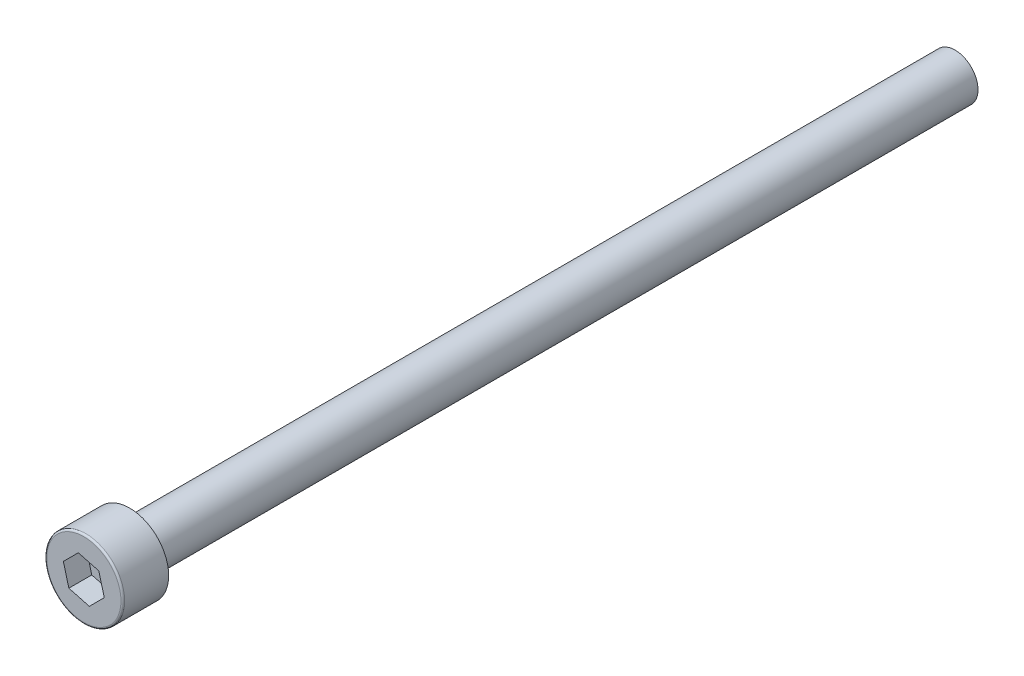
ISO-10303-21;
HEADER;
FILE_DESCRIPTION(('STEP AP214'),'2;1');
FILE_NAME('part.step','',(''),(''),'','','');
FILE_SCHEMA(('AUTOMOTIVE_DESIGN { 1 0 10303 214 1 1 1 1 }'));
ENDSEC;
DATA;
#1=APPLICATION_CONTEXT('core data for automotive mechanical design processes');
#2=APPLICATION_PROTOCOL_DEFINITION('international standard','automotive_design',2000,#1);
#3=PRODUCT_CONTEXT('',#1,'mechanical');
#4=PRODUCT('Part','Part','',(#3));
#5=PRODUCT_RELATED_PRODUCT_CATEGORY('part','',(#4));
#6=PRODUCT_DEFINITION_FORMATION('','',#4);
#7=PRODUCT_DEFINITION_CONTEXT('part definition',#1,'design');
#8=PRODUCT_DEFINITION('design','',#6,#7);
#9=PRODUCT_DEFINITION_SHAPE('','',#8);
#10=(LENGTH_UNIT() NAMED_UNIT(*) SI_UNIT(.MILLI.,.METRE.));
#11=(NAMED_UNIT(*) PLANE_ANGLE_UNIT() SI_UNIT($,.RADIAN.));
#12=(NAMED_UNIT(*) SI_UNIT($,.STERADIAN.) SOLID_ANGLE_UNIT());
#13=UNCERTAINTY_MEASURE_WITH_UNIT(LENGTH_MEASURE(1.E-05),#10,'distance_accuracy_value','');
#14=(GEOMETRIC_REPRESENTATION_CONTEXT(3) GLOBAL_UNCERTAINTY_ASSIGNED_CONTEXT((#13)) GLOBAL_UNIT_ASSIGNED_CONTEXT((#10,
#11,#12)) REPRESENTATION_CONTEXT('',''));
#15=CARTESIAN_POINT('',(0.,0.,0.));
#16=DIRECTION('',(0.,0.,1.));
#17=DIRECTION('',(1.,0.,0.));
#18=AXIS2_PLACEMENT_3D('',#15,#16,#17);
#19=CARTESIAN_POINT('',(0.,0.,0.));
#20=DIRECTION('',(0.,0.,1.));
#21=DIRECTION('',(1.,0.,0.));
#22=AXIS2_PLACEMENT_3D('',#19,#20,#21);
#23=PLANE('',#22);
#24=CARTESIAN_POINT('',(0.,0.,0.));
#25=DIRECTION('',(0.,0.,1.));
#26=DIRECTION('',(1.,0.,0.));
#27=AXIS2_PLACEMENT_3D('',#24,#25,#26);
#28=CIRCLE('',#27,4.25);
#29=CARTESIAN_POINT('',(4.25,0.,0.));
#30=VERTEX_POINT('',#29);
#31=EDGE_CURVE('E138',#30,#30,#28,.T.);
#32=ORIENTED_EDGE('',*,*,#31,.F.);
#33=EDGE_LOOP('',(#32));
#34=FACE_BOUND('',#33,.T.);
#35=CARTESIAN_POINT('',(0.,0.,0.));
#36=DIRECTION('',(0.,0.,1.));
#37=DIRECTION('',(1.,0.,0.));
#38=AXIS2_PLACEMENT_3D('',#35,#36,#37);
#39=CIRCLE('',#38,2.5);
#40=CARTESIAN_POINT('',(2.5,0.,0.));
#41=VERTEX_POINT('',#40);
#42=EDGE_CURVE('E146',#41,#41,#39,.F.);
#43=ORIENTED_EDGE('',*,*,#42,.F.);
#44=EDGE_LOOP('',(#43));
#45=FACE_BOUND('',#44,.T.);
#46=ADVANCED_FACE('F35',(#34,#45),#23,.F.);
#47=CARTESIAN_POINT('',(0.,0.,5.));
#48=DIRECTION('',(0.,0.,-1.));
#49=DIRECTION('',(-1.,0.,0.));
#50=AXIS2_PLACEMENT_3D('',#47,#48,#49);
#51=CYLINDRICAL_SURFACE('',#50,4.25);
#52=CARTESIAN_POINT('',(0.,0.,4.8));
#53=DIRECTION('',(0.,0.,1.));
#54=DIRECTION('',(1.,0.,0.));
#55=AXIS2_PLACEMENT_3D('',#52,#53,#54);
#56=CIRCLE('',#55,4.25);
#57=CARTESIAN_POINT('',(4.25,0.,4.8));
#58=VERTEX_POINT('',#57);
#59=EDGE_CURVE('E11',#58,#58,#56,.F.);
#60=ORIENTED_EDGE('',*,*,#59,.T.);
#61=EDGE_LOOP('',(#60));
#62=FACE_BOUND('',#61,.T.);
#63=ORIENTED_EDGE('',*,*,#31,.T.);
#64=EDGE_LOOP('',(#63));
#65=FACE_BOUND('',#64,.T.);
#66=ADVANCED_FACE('F165',(#62,#65),#51,.T.);
#67=CARTESIAN_POINT('',(0.,0.,5.));
#68=DIRECTION('',(0.,0.,1.));
#69=DIRECTION('',(1.,0.,0.));
#70=AXIS2_PLACEMENT_3D('',#67,#68,#69);
#71=PLANE('',#70);
#72=CARTESIAN_POINT('',(0.,0.,5.));
#73=DIRECTION('',(0.,0.,1.));
#74=DIRECTION('',(1.,0.,0.));
#75=AXIS2_PLACEMENT_3D('',#72,#73,#74);
#76=CIRCLE('',#75,4.05);
#77=CARTESIAN_POINT('',(4.05,0.,5.));
#78=VERTEX_POINT('',#77);
#79=EDGE_CURVE('E43',#78,#78,#76,.T.);
#80=ORIENTED_EDGE('',*,*,#79,.T.);
#81=EDGE_LOOP('',(#80));
#82=FACE_BOUND('',#81,.T.);
#83=DIRECTION('',(0.258819045102521,-0.965925826289068,0.));
#84=VECTOR('',#83,1.);
#85=CARTESIAN_POINT('',(-2.23071014330082,0.597716981445369,5.));
#86=LINE('',#85,#84);
#87=CARTESIAN_POINT('',(-2.23071014330082,0.597716981445369,5.));
#88=VERTEX_POINT('',#87);
#89=CARTESIAN_POINT('',(-1.63299316185545,-1.63299316185545,5.));
#90=VERTEX_POINT('',#89);
#91=EDGE_CURVE('E50',#88,#90,#86,.T.);
#92=ORIENTED_EDGE('',*,*,#91,.F.);
#93=DIRECTION('',(-0.707106781186547,-0.707106781186548,0.));
#94=VECTOR('',#93,1.);
#95=CARTESIAN_POINT('',(-0.597716981445369,2.23071014330082,5.));
#96=LINE('',#95,#94);
#97=CARTESIAN_POINT('',(-0.597716981445369,2.23071014330082,5.));
#98=VERTEX_POINT('',#97);
#99=EDGE_CURVE('E134',#98,#88,#96,.T.);
#100=ORIENTED_EDGE('',*,*,#99,.F.);
#101=DIRECTION('',(-0.965925826289068,0.258819045102521,0.));
#102=VECTOR('',#101,1.);
#103=CARTESIAN_POINT('',(1.63299316185545,1.63299316185545,5.));
#104=LINE('',#103,#102);
#105=CARTESIAN_POINT('',(1.63299316185545,1.63299316185545,5.));
#106=VERTEX_POINT('',#105);
#107=EDGE_CURVE('E132',#106,#98,#104,.T.);
#108=ORIENTED_EDGE('',*,*,#107,.F.);
#109=DIRECTION('',(-0.258819045102521,0.965925826289068,0.));
#110=VECTOR('',#109,1.);
#111=CARTESIAN_POINT('',(2.23071014330082,-0.597716981445369,5.));
#112=LINE('',#111,#110);
#113=CARTESIAN_POINT('',(2.23071014330082,-0.597716981445369,5.));
#114=VERTEX_POINT('',#113);
#115=EDGE_CURVE('E98',#114,#106,#112,.T.);
#116=ORIENTED_EDGE('',*,*,#115,.F.);
#117=DIRECTION('',(0.707106781186547,0.707106781186547,0.));
#118=VECTOR('',#117,1.);
#119=CARTESIAN_POINT('',(0.597716981445369,-2.23071014330082,5.));
#120=LINE('',#119,#118);
#121=CARTESIAN_POINT('',(0.597716981445369,-2.23071014330082,5.));
#122=VERTEX_POINT('',#121);
#123=EDGE_CURVE('E128',#122,#114,#120,.T.);
#124=ORIENTED_EDGE('',*,*,#123,.F.);
#125=DIRECTION('',(0.965925826289068,-0.258819045102521,0.));
#126=VECTOR('',#125,1.);
#127=CARTESIAN_POINT('',(-1.63299316185545,-1.63299316185545,5.));
#128=LINE('',#127,#126);
#129=EDGE_CURVE('E124',#90,#122,#128,.T.);
#130=ORIENTED_EDGE('',*,*,#129,.F.);
#131=EDGE_LOOP('',(#92,#100,#108,#116,#124,#130));
#132=FACE_BOUND('',#131,.T.);
#133=ADVANCED_FACE('F151',(#82,#132),#71,.T.);
#134=CARTESIAN_POINT('',(-2.23071014330082,0.597716981445369,2.5));
#135=DIRECTION('',(-0.965925826289068,-0.258819045102521,0.));
#136=DIRECTION('',(0.258819045102521,-0.965925826289068,0.));
#137=AXIS2_PLACEMENT_3D('',#134,#135,#136);
#138=PLANE('',#137);
#139=ORIENTED_EDGE('',*,*,#91,.T.);
#140=DIRECTION('',(0.,0.,1.));
#141=VECTOR('',#140,1.);
#142=CARTESIAN_POINT('',(-1.63299316185545,-1.63299316185545,2.5));
#143=LINE('',#142,#141);
#144=CARTESIAN_POINT('',(-1.63299316185545,-1.63299316185545,2.5));
#145=VERTEX_POINT('',#144);
#146=EDGE_CURVE('E80',#145,#90,#143,.T.);
#147=ORIENTED_EDGE('',*,*,#146,.F.);
#148=DIRECTION('',(0.258819045102521,-0.965925826289068,0.));
#149=VECTOR('',#148,1.);
#150=CARTESIAN_POINT('',(-2.23071014330082,0.597716981445369,2.5));
#151=LINE('',#150,#149);
#152=CARTESIAN_POINT('',(-2.23071014330082,0.597716981445369,2.5));
#153=VERTEX_POINT('',#152);
#154=EDGE_CURVE('E136',#153,#145,#151,.T.);
#155=ORIENTED_EDGE('',*,*,#154,.F.);
#156=DIRECTION('',(0.,0.,1.));
#157=VECTOR('',#156,1.);
#158=CARTESIAN_POINT('',(-2.23071014330082,0.597716981445369,2.5));
#159=LINE('',#158,#157);
#160=EDGE_CURVE('E58',#153,#88,#159,.T.);
#161=ORIENTED_EDGE('',*,*,#160,.T.);
#162=EDGE_LOOP('',(#139,#147,#155,#161));
#163=FACE_BOUND('',#162,.T.);
#164=ADVANCED_FACE('F177',(#163),#138,.F.);
#165=CARTESIAN_POINT('',(-0.597716981445369,2.23071014330082,2.5));
#166=DIRECTION('',(-0.707106781186548,0.707106781186547,0.));
#167=DIRECTION('',(-0.707106781186547,-0.707106781186548,0.));
#168=AXIS2_PLACEMENT_3D('',#165,#166,#167);
#169=PLANE('',#168);
#170=ORIENTED_EDGE('',*,*,#99,.T.);
#171=ORIENTED_EDGE('',*,*,#160,.F.);
#172=DIRECTION('',(-0.707106781186547,-0.707106781186548,0.));
#173=VECTOR('',#172,1.);
#174=CARTESIAN_POINT('',(-0.597716981445369,2.23071014330082,2.5));
#175=LINE('',#174,#173);
#176=CARTESIAN_POINT('',(-0.597716981445369,2.23071014330082,2.5));
#177=VERTEX_POINT('',#176);
#178=EDGE_CURVE('E110',#177,#153,#175,.T.);
#179=ORIENTED_EDGE('',*,*,#178,.F.);
#180=DIRECTION('',(0.,0.,1.));
#181=VECTOR('',#180,1.);
#182=CARTESIAN_POINT('',(-0.597716981445369,2.23071014330082,2.5));
#183=LINE('',#182,#181);
#184=EDGE_CURVE('E102',#177,#98,#183,.T.);
#185=ORIENTED_EDGE('',*,*,#184,.T.);
#186=EDGE_LOOP('',(#170,#171,#179,#185));
#187=FACE_BOUND('',#186,.T.);
#188=ADVANCED_FACE('F180',(#187),#169,.F.);
#189=CARTESIAN_POINT('',(1.63299316185545,1.63299316185545,2.5));
#190=DIRECTION('',(0.258819045102521,0.965925826289068,0.));
#191=DIRECTION('',(-0.965925826289068,0.258819045102521,0.));
#192=AXIS2_PLACEMENT_3D('',#189,#190,#191);
#193=PLANE('',#192);
#194=ORIENTED_EDGE('',*,*,#107,.T.);
#195=ORIENTED_EDGE('',*,*,#184,.F.);
#196=DIRECTION('',(-0.965925826289068,0.258819045102521,0.));
#197=VECTOR('',#196,1.);
#198=CARTESIAN_POINT('',(1.63299316185545,1.63299316185545,2.5));
#199=LINE('',#198,#197);
#200=CARTESIAN_POINT('',(1.63299316185545,1.63299316185545,2.5));
#201=VERTEX_POINT('',#200);
#202=EDGE_CURVE('E106',#201,#177,#199,.T.);
#203=ORIENTED_EDGE('',*,*,#202,.F.);
#204=DIRECTION('',(0.,0.,1.));
#205=VECTOR('',#204,1.);
#206=CARTESIAN_POINT('',(1.63299316185545,1.63299316185545,2.5));
#207=LINE('',#206,#205);
#208=EDGE_CURVE('E91',#201,#106,#207,.T.);
#209=ORIENTED_EDGE('',*,*,#208,.T.);
#210=EDGE_LOOP('',(#194,#195,#203,#209));
#211=FACE_BOUND('',#210,.T.);
#212=ADVANCED_FACE('F107',(#211),#193,.F.);
#213=CARTESIAN_POINT('',(2.23071014330082,-0.597716981445369,2.5));
#214=DIRECTION('',(0.965925826289068,0.258819045102521,0.));
#215=DIRECTION('',(-0.258819045102521,0.965925826289068,0.));
#216=AXIS2_PLACEMENT_3D('',#213,#214,#215);
#217=PLANE('',#216);
#218=ORIENTED_EDGE('',*,*,#115,.T.);
#219=ORIENTED_EDGE('',*,*,#208,.F.);
#220=DIRECTION('',(-0.258819045102521,0.965925826289068,0.));
#221=VECTOR('',#220,1.);
#222=CARTESIAN_POINT('',(2.23071014330082,-0.597716981445369,2.5));
#223=LINE('',#222,#221);
#224=CARTESIAN_POINT('',(2.23071014330082,-0.597716981445369,2.5));
#225=VERTEX_POINT('',#224);
#226=EDGE_CURVE('E95',#225,#201,#223,.T.);
#227=ORIENTED_EDGE('',*,*,#226,.F.);
#228=DIRECTION('',(0.,0.,1.));
#229=VECTOR('',#228,1.);
#230=CARTESIAN_POINT('',(2.23071014330082,-0.597716981445369,2.5));
#231=LINE('',#230,#229);
#232=EDGE_CURVE('E103',#225,#114,#231,.T.);
#233=ORIENTED_EDGE('',*,*,#232,.T.);
#234=EDGE_LOOP('',(#218,#219,#227,#233));
#235=FACE_BOUND('',#234,.T.);
#236=ADVANCED_FACE('F93',(#235),#217,.F.);
#237=CARTESIAN_POINT('',(0.597716981445369,-2.23071014330082,2.5));
#238=DIRECTION('',(0.707106781186548,-0.707106781186548,0.));
#239=DIRECTION('',(0.707106781186548,0.707106781186548,0.));
#240=AXIS2_PLACEMENT_3D('',#237,#238,#239);
#241=PLANE('',#240);
#242=ORIENTED_EDGE('',*,*,#123,.T.);
#243=ORIENTED_EDGE('',*,*,#232,.F.);
#244=DIRECTION('',(0.707106781186547,0.707106781186547,0.));
#245=VECTOR('',#244,1.);
#246=CARTESIAN_POINT('',(0.597716981445369,-2.23071014330082,2.5));
#247=LINE('',#246,#245);
#248=CARTESIAN_POINT('',(0.597716981445369,-2.23071014330082,2.5));
#249=VERTEX_POINT('',#248);
#250=EDGE_CURVE('E116',#249,#225,#247,.T.);
#251=ORIENTED_EDGE('',*,*,#250,.F.);
#252=DIRECTION('',(0.,0.,1.));
#253=VECTOR('',#252,1.);
#254=CARTESIAN_POINT('',(0.597716981445369,-2.23071014330082,2.5));
#255=LINE('',#254,#253);
#256=EDGE_CURVE('E141',#249,#122,#255,.T.);
#257=ORIENTED_EDGE('',*,*,#256,.T.);
#258=EDGE_LOOP('',(#242,#243,#251,#257));
#259=FACE_BOUND('',#258,.T.);
#260=ADVANCED_FACE('F184',(#259),#241,.F.);
#261=CARTESIAN_POINT('',(-1.63299316185545,-1.63299316185545,2.5));
#262=DIRECTION('',(-0.258819045102521,-0.965925826289068,0.));
#263=DIRECTION('',(0.965925826289068,-0.258819045102521,0.));
#264=AXIS2_PLACEMENT_3D('',#261,#262,#263);
#265=PLANE('',#264);
#266=ORIENTED_EDGE('',*,*,#129,.T.);
#267=ORIENTED_EDGE('',*,*,#256,.F.);
#268=DIRECTION('',(0.965925826289068,-0.258819045102521,0.));
#269=VECTOR('',#268,1.);
#270=CARTESIAN_POINT('',(-1.63299316185545,-1.63299316185545,2.5));
#271=LINE('',#270,#269);
#272=EDGE_CURVE('E118',#145,#249,#271,.T.);
#273=ORIENTED_EDGE('',*,*,#272,.F.);
#274=ORIENTED_EDGE('',*,*,#146,.T.);
#275=EDGE_LOOP('',(#266,#267,#273,#274));
#276=FACE_BOUND('',#275,.T.);
#277=ADVANCED_FACE('F181',(#276),#265,.F.);
#278=CARTESIAN_POINT('',(0.,0.,2.5));
#279=DIRECTION('',(0.,0.,1.));
#280=DIRECTION('',(1.,0.,0.));
#281=AXIS2_PLACEMENT_3D('',#278,#279,#280);
#282=PLANE('',#281);
#283=ORIENTED_EDGE('',*,*,#154,.T.);
#284=ORIENTED_EDGE('',*,*,#272,.T.);
#285=ORIENTED_EDGE('',*,*,#250,.T.);
#286=ORIENTED_EDGE('',*,*,#226,.T.);
#287=ORIENTED_EDGE('',*,*,#202,.T.);
#288=ORIENTED_EDGE('',*,*,#178,.T.);
#289=EDGE_LOOP('',(#283,#284,#285,#286,#287,#288));
#290=FACE_BOUND('',#289,.T.);
#291=ADVANCED_FACE('F113',(#290),#282,.T.);
#292=CARTESIAN_POINT('',(0.,0.,-90.));
#293=DIRECTION('',(0.,0.,1.));
#294=DIRECTION('',(1.,0.,0.));
#295=AXIS2_PLACEMENT_3D('',#292,#293,#294);
#296=CYLINDRICAL_SURFACE('',#295,2.5);
#297=CARTESIAN_POINT('',(0.,0.,-90.));
#298=DIRECTION('',(0.,0.,-1.));
#299=DIRECTION('',(-1.,0.,0.));
#300=AXIS2_PLACEMENT_3D('',#297,#298,#299);
#301=CIRCLE('',#300,2.5);
#302=CARTESIAN_POINT('',(2.5,0.,-90.));
#303=VERTEX_POINT('',#302);
#304=EDGE_CURVE('E125',#303,#303,#301,.T.);
#305=CARTESIAN_POINT('',(2.5,0.,-90.));
#306=CARTESIAN_POINT('',(2.5,0.,-89.0625));
#307=CARTESIAN_POINT('',(2.5,0.,-88.125));
#308=CARTESIAN_POINT('',(2.5,0.,-86.25));
#309=CARTESIAN_POINT('',(2.5,0.,-85.3125));
#310=CARTESIAN_POINT('',(2.5,0.,-83.4375));
#311=CARTESIAN_POINT('',(2.5,0.,-82.5));
#312=CARTESIAN_POINT('',(2.5,0.,-80.625));
#313=CARTESIAN_POINT('',(2.5,0.,-79.6875));
#314=CARTESIAN_POINT('',(2.5,0.,-77.8125));
#315=CARTESIAN_POINT('',(2.5,0.,-76.875));
#316=CARTESIAN_POINT('',(2.5,0.,-75.));
#317=CARTESIAN_POINT('',(2.5,0.,-74.0625));
#318=CARTESIAN_POINT('',(2.5,0.,-72.1875));
#319=CARTESIAN_POINT('',(2.5,0.,-71.25));
#320=CARTESIAN_POINT('',(2.5,0.,-69.375));
#321=CARTESIAN_POINT('',(2.5,0.,-68.4375));
#322=CARTESIAN_POINT('',(2.5,0.,-66.5625));
#323=CARTESIAN_POINT('',(2.5,0.,-65.625));
#324=CARTESIAN_POINT('',(2.5,0.,-63.75));
#325=CARTESIAN_POINT('',(2.5,0.,-62.8125));
#326=CARTESIAN_POINT('',(2.5,0.,-60.9375));
#327=CARTESIAN_POINT('',(2.5,0.,-60.));
#328=CARTESIAN_POINT('',(2.5,0.,-58.125));
#329=CARTESIAN_POINT('',(2.5,0.,-57.1875));
#330=CARTESIAN_POINT('',(2.5,0.,-55.3125));
#331=CARTESIAN_POINT('',(2.5,0.,-54.375));
#332=CARTESIAN_POINT('',(2.5,0.,-52.5));
#333=CARTESIAN_POINT('',(2.5,0.,-51.5625));
#334=CARTESIAN_POINT('',(2.5,0.,-49.6875));
#335=CARTESIAN_POINT('',(2.5,0.,-48.75));
#336=CARTESIAN_POINT('',(2.5,0.,-46.875));
#337=CARTESIAN_POINT('',(2.5,0.,-45.9375));
#338=CARTESIAN_POINT('',(2.5,0.,-44.0625));
#339=CARTESIAN_POINT('',(2.5,0.,-43.125));
#340=CARTESIAN_POINT('',(2.5,0.,-41.25));
#341=CARTESIAN_POINT('',(2.5,0.,-40.3125));
#342=CARTESIAN_POINT('',(2.5,0.,-38.4375));
#343=CARTESIAN_POINT('',(2.5,0.,-37.5));
#344=CARTESIAN_POINT('',(2.5,0.,-35.625));
#345=CARTESIAN_POINT('',(2.5,0.,-34.6875));
#346=CARTESIAN_POINT('',(2.5,0.,-32.8125));
#347=CARTESIAN_POINT('',(2.5,0.,-31.875));
#348=CARTESIAN_POINT('',(2.5,0.,-30.));
#349=CARTESIAN_POINT('',(2.5,0.,-29.0625));
#350=CARTESIAN_POINT('',(2.5,0.,-27.1875));
#351=CARTESIAN_POINT('',(2.5,0.,-26.25));
#352=CARTESIAN_POINT('',(2.5,0.,-24.375));
#353=CARTESIAN_POINT('',(2.5,0.,-23.4375));
#354=CARTESIAN_POINT('',(2.5,0.,-21.5625));
#355=CARTESIAN_POINT('',(2.5,0.,-20.625));
#356=CARTESIAN_POINT('',(2.5,0.,-18.75));
#357=CARTESIAN_POINT('',(2.5,0.,-17.8125));
#358=CARTESIAN_POINT('',(2.5,0.,-15.9375));
#359=CARTESIAN_POINT('',(2.5,0.,-15.));
#360=CARTESIAN_POINT('',(2.5,0.,-13.125));
#361=CARTESIAN_POINT('',(2.5,0.,-12.1875));
#362=CARTESIAN_POINT('',(2.5,0.,-10.3125));
#363=CARTESIAN_POINT('',(2.5,0.,-9.37500000000001));
#364=CARTESIAN_POINT('',(2.5,0.,-7.50000000000002));
#365=CARTESIAN_POINT('',(2.5,0.,-6.56250000000002));
#366=CARTESIAN_POINT('',(2.5,0.,-4.68750000000002));
#367=CARTESIAN_POINT('',(2.5,0.,-3.75000000000001));
#368=CARTESIAN_POINT('',(2.5,0.,-1.87500000000001));
#369=CARTESIAN_POINT('',(2.5,0.,-0.937500000000014));
#370=CARTESIAN_POINT('',(2.5,0.,0.));
#371=B_SPLINE_CURVE_WITH_KNOTS('',3,(#305,#306,#307,#308,#309,#310,#311,#312,#313,#314,#315,
#316,#317,#318,#319,#320,#321,#322,#323,#324,#325,#326,#327,#328,#329,#330,#331,#332,#333,#334,
#335,#336,#337,#338,#339,#340,#341,#342,#343,#344,#345,#346,#347,#348,#349,#350,#351,#352,#353,
#354,#355,#356,#357,#358,#359,#360,#361,#362,#363,#364,#365,#366,#367,#368,#369,#370),
.UNSPECIFIED.,.F.,.F.,(4,2,2,2,2,2,2,2,2,2,2,2,2,2,2,2,2,2,2,2,2,2,2,2,2,2,2,2,2,2,2,2,4),(0.,
2.81250000000001,5.62500000000001,8.4375,11.25,14.0625,16.875,19.6875,22.5,25.3125,28.125,
30.9375,33.75,36.5625,39.375,42.1875,45.,47.8125,50.625,53.4375,56.25,59.0625,61.875,64.6875,
67.5,70.3125,73.125,75.9375,78.75,81.5625,84.375,87.1875,90.),.UNSPECIFIED.);
#372=EDGE_CURVE('BSEAM160',#303,#41,#371,.T.);
#373=ORIENTED_EDGE('',*,*,#304,.F.);
#374=ORIENTED_EDGE('',*,*,#42,.T.);
#375=ORIENTED_EDGE('',*,*,#372,.T.);
#376=ORIENTED_EDGE('',*,*,#372,.F.);
#377=EDGE_LOOP('',(#373,#375,#374,#376));
#378=FACE_BOUND('',#377,.T.);
#379=ADVANCED_FACE('F160',(#378),#296,.T.);
#380=CARTESIAN_POINT('',(0.,0.,-90.));
#381=DIRECTION('',(0.,0.,-1.));
#382=DIRECTION('',(-1.,0.,0.));
#383=AXIS2_PLACEMENT_3D('',#380,#381,#382);
#384=PLANE('',#383);
#385=ORIENTED_EDGE('',*,*,#304,.T.);
#386=EDGE_LOOP('',(#385));
#387=FACE_BOUND('',#386,.T.);
#388=ADVANCED_FACE('F155',(#387),#384,.T.);
#389=CARTESIAN_POINT('',(0.,0.,4.8));
#390=DIRECTION('',(0.,0.,1.));
#391=DIRECTION('',(1.,0.,0.));
#392=AXIS2_PLACEMENT_3D('',#389,#390,#391);
#393=TOROIDAL_SURFACE('',#392,4.05,0.2);
#394=ORIENTED_EDGE('',*,*,#59,.F.);
#395=EDGE_LOOP('',(#394));
#396=FACE_BOUND('',#395,.T.);
#397=ORIENTED_EDGE('',*,*,#79,.F.);
#398=EDGE_LOOP('',(#397));
#399=FACE_BOUND('',#398,.T.);
#400=ADVANCED_FACE('F37',(#396,#399),#393,.T.);
#401=CLOSED_SHELL('',(#46,#66,#133,#164,#188,#212,#236,#260,#277,#291,#379,#388,#400));
#402=MANIFOLD_SOLID_BREP('B2',#401);
#403=ADVANCED_BREP_SHAPE_REPRESENTATION('',(#18,#402),#14);
#404=SHAPE_DEFINITION_REPRESENTATION(#9,#403);
ENDSEC;
END-ISO-10303-21;
